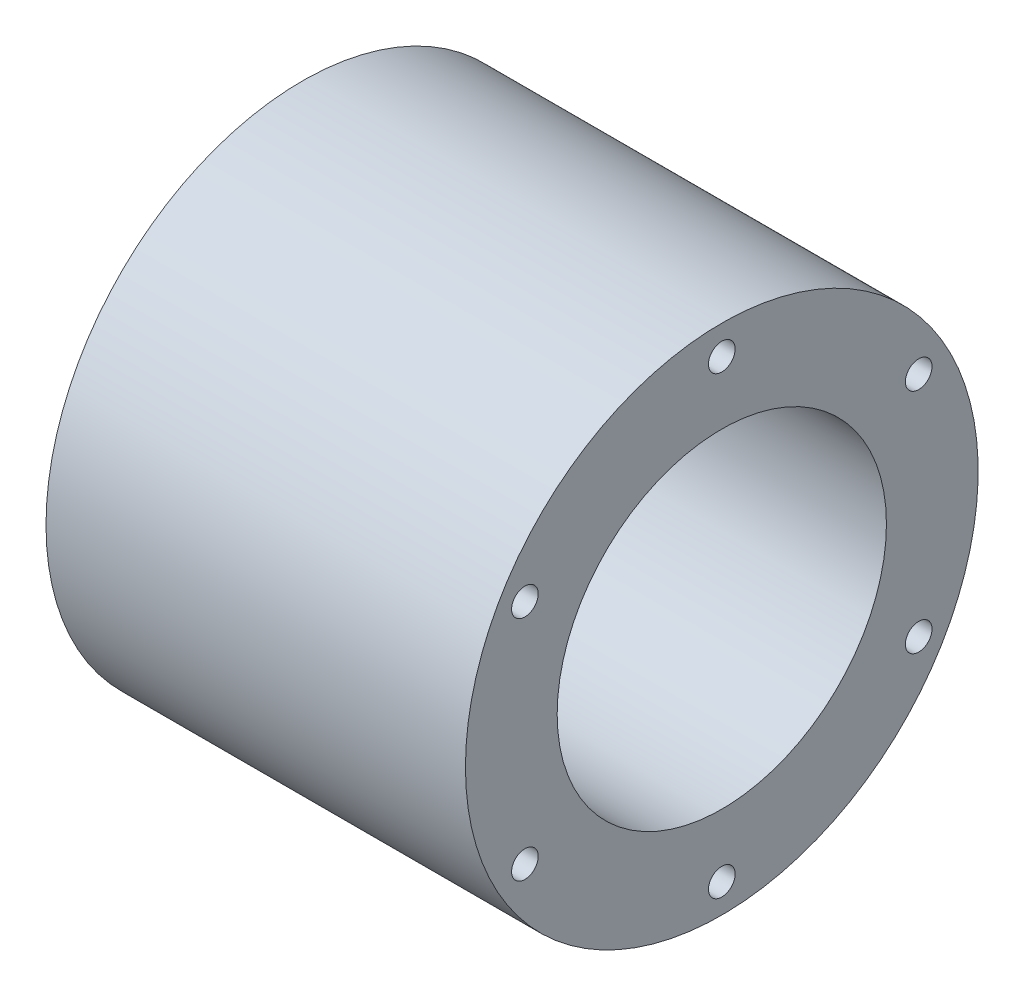
ISO-10303-21;
HEADER;
FILE_DESCRIPTION(('STEP AP214'),'2;1');
FILE_NAME('part.step','',(''),(''),'','','');
FILE_SCHEMA(('AUTOMOTIVE_DESIGN { 1 0 10303 214 1 1 1 1 }'));
ENDSEC;
DATA;
#1=APPLICATION_CONTEXT('core data for automotive mechanical design processes');
#2=APPLICATION_PROTOCOL_DEFINITION('international standard','automotive_design',2000,#1);
#3=PRODUCT_CONTEXT('',#1,'mechanical');
#4=PRODUCT('Part','Part','',(#3));
#5=PRODUCT_RELATED_PRODUCT_CATEGORY('part','',(#4));
#6=PRODUCT_DEFINITION_FORMATION('','',#4);
#7=PRODUCT_DEFINITION_CONTEXT('part definition',#1,'design');
#8=PRODUCT_DEFINITION('design','',#6,#7);
#9=PRODUCT_DEFINITION_SHAPE('','',#8);
#10=(LENGTH_UNIT() NAMED_UNIT(*) SI_UNIT(.MILLI.,.METRE.));
#11=(NAMED_UNIT(*) PLANE_ANGLE_UNIT() SI_UNIT($,.RADIAN.));
#12=(NAMED_UNIT(*) SI_UNIT($,.STERADIAN.) SOLID_ANGLE_UNIT());
#13=UNCERTAINTY_MEASURE_WITH_UNIT(LENGTH_MEASURE(1.E-05),#10,'distance_accuracy_value','');
#14=(GEOMETRIC_REPRESENTATION_CONTEXT(3) GLOBAL_UNCERTAINTY_ASSIGNED_CONTEXT((#13)) GLOBAL_UNIT_ASSIGNED_CONTEXT((#10,
#11,#12)) REPRESENTATION_CONTEXT('',''));
#15=CARTESIAN_POINT('',(0.,0.,0.));
#16=DIRECTION('',(0.,0.,1.));
#17=DIRECTION('',(1.,0.,0.));
#18=AXIS2_PLACEMENT_3D('',#15,#16,#17);
#19=CARTESIAN_POINT('',(-24.25,0.,0.));
#20=DIRECTION('',(1.,0.,0.));
#21=DIRECTION('',(0.,0.,-1.));
#22=AXIS2_PLACEMENT_3D('',#19,#20,#21);
#23=PLANE('',#22);
#24=CARTESIAN_POINT('',(-24.25,0.,0.));
#25=DIRECTION('',(1.,0.,0.));
#26=DIRECTION('',(0.,0.,-1.));
#27=AXIS2_PLACEMENT_3D('',#24,#25,#26);
#28=CIRCLE('',#27,21.);
#29=CARTESIAN_POINT('',(-24.25,-21.,0.));
#30=VERTEX_POINT('',#29);
#31=CARTESIAN_POINT('',(-24.25,-16.9951967415429,-12.3354484197474));
#32=VERTEX_POINT('',#31);
#33=EDGE_CURVE('E354',#30,#32,#28,.T.);
#34=ORIENTED_EDGE('',*,*,#33,.T.);
#35=CARTESIAN_POINT('',(-24.25,-15.5,-15.5));
#36=DIRECTION('',(-1.,0.,0.));
#37=DIRECTION('',(0.,0.,1.));
#38=AXIS2_PLACEMENT_3D('',#35,#36,#37);
#39=CIRCLE('',#38,3.5);
#40=CARTESIAN_POINT('',(-24.25,-12.3354484197474,-16.9951967415429));
#41=VERTEX_POINT('',#40);
#42=EDGE_CURVE('E224',#41,#32,#39,.T.);
#43=ORIENTED_EDGE('',*,*,#42,.F.);
#44=CARTESIAN_POINT('',(-24.25,0.,-21.));
#45=VERTEX_POINT('',#44);
#46=EDGE_CURVE('E296',#41,#45,#28,.T.);
#47=ORIENTED_EDGE('',*,*,#46,.T.);
#48=DIRECTION('',(0.,-1.,0.));
#49=VECTOR('',#48,1.);
#50=CARTESIAN_POINT('',(-24.25,-18.,-21.));
#51=LINE('',#50,#49);
#52=CARTESIAN_POINT('',(-24.25,-18.,-21.));
#53=VERTEX_POINT('',#52);
#54=EDGE_CURVE('E276',#45,#53,#51,.T.);
#55=ORIENTED_EDGE('',*,*,#54,.T.);
#56=CARTESIAN_POINT('',(-24.25,-18.,-18.));
#57=DIRECTION('',(-1.,0.,0.));
#58=DIRECTION('',(0.,0.,-1.));
#59=AXIS2_PLACEMENT_3D('',#56,#57,#58);
#60=CIRCLE('',#59,3.);
#61=CARTESIAN_POINT('',(-24.25,-21.,-18.));
#62=VERTEX_POINT('',#61);
#63=EDGE_CURVE('E230',#53,#62,#60,.T.);
#64=ORIENTED_EDGE('',*,*,#63,.T.);
#65=DIRECTION('',(0.,0.,1.));
#66=VECTOR('',#65,1.);
#67=CARTESIAN_POINT('',(-24.25,-21.,-18.));
#68=LINE('',#67,#66);
#69=EDGE_CURVE('E253',#62,#30,#68,.T.);
#70=ORIENTED_EDGE('',*,*,#69,.T.);
#71=EDGE_LOOP('',(#34,#43,#47,#55,#64,#70));
#72=FACE_BOUND('',#71,.T.);
#73=ADVANCED_FACE('F32',(#72),#23,.F.);
#74=CARTESIAN_POINT('',(-24.25,0.,21.));
#75=VERTEX_POINT('',#74);
#76=CARTESIAN_POINT('',(-24.25,-12.3354484197474,16.9951967415429));
#77=VERTEX_POINT('',#76);
#78=EDGE_CURVE('E348',#75,#77,#28,.T.);
#79=ORIENTED_EDGE('',*,*,#78,.T.);
#80=CARTESIAN_POINT('',(-24.25,-15.5,15.5));
#81=DIRECTION('',(-1.,0.,0.));
#82=DIRECTION('',(0.,0.,1.));
#83=AXIS2_PLACEMENT_3D('',#80,#81,#82);
#84=CIRCLE('',#83,3.5);
#85=CARTESIAN_POINT('',(-24.25,-16.9951967415429,12.3354484197474));
#86=VERTEX_POINT('',#85);
#87=EDGE_CURVE('E217',#86,#77,#84,.T.);
#88=ORIENTED_EDGE('',*,*,#87,.F.);
#89=EDGE_CURVE('E345',#86,#30,#28,.T.);
#90=ORIENTED_EDGE('',*,*,#89,.T.);
#91=CARTESIAN_POINT('',(-24.25,-21.,18.));
#92=VERTEX_POINT('',#91);
#93=EDGE_CURVE('E257',#30,#92,#68,.T.);
#94=ORIENTED_EDGE('',*,*,#93,.T.);
#95=CARTESIAN_POINT('',(-24.25,-18.,18.));
#96=DIRECTION('',(-1.,0.,0.));
#97=DIRECTION('',(0.,0.,1.));
#98=AXIS2_PLACEMENT_3D('',#95,#96,#97);
#99=CIRCLE('',#98,3.);
#100=CARTESIAN_POINT('',(-24.25,-18.,21.));
#101=VERTEX_POINT('',#100);
#102=EDGE_CURVE('E256',#92,#101,#99,.T.);
#103=ORIENTED_EDGE('',*,*,#102,.T.);
#104=DIRECTION('',(0.,1.,0.));
#105=VECTOR('',#104,1.);
#106=CARTESIAN_POINT('',(-24.25,-18.,21.));
#107=LINE('',#106,#105);
#108=EDGE_CURVE('E260',#101,#75,#107,.T.);
#109=ORIENTED_EDGE('',*,*,#108,.T.);
#110=EDGE_LOOP('',(#79,#88,#90,#94,#103,#109));
#111=FACE_BOUND('',#110,.T.);
#112=ADVANCED_FACE('F343',(#111),#23,.F.);
#113=CARTESIAN_POINT('',(-24.25,21.,0.));
#114=VERTEX_POINT('',#113);
#115=CARTESIAN_POINT('',(-24.25,16.9951967415429,12.3354484197474));
#116=VERTEX_POINT('',#115);
#117=EDGE_CURVE('E306',#114,#116,#28,.T.);
#118=ORIENTED_EDGE('',*,*,#117,.T.);
#119=CARTESIAN_POINT('',(-24.25,15.5,15.5));
#120=DIRECTION('',(-1.,0.,0.));
#121=DIRECTION('',(0.,0.,1.));
#122=AXIS2_PLACEMENT_3D('',#119,#120,#121);
#123=CIRCLE('',#122,3.5);
#124=CARTESIAN_POINT('',(-24.25,12.3354484197474,16.9951967415429));
#125=VERTEX_POINT('',#124);
#126=EDGE_CURVE('E220',#125,#116,#123,.T.);
#127=ORIENTED_EDGE('',*,*,#126,.F.);
#128=EDGE_CURVE('E305',#125,#75,#28,.T.);
#129=ORIENTED_EDGE('',*,*,#128,.T.);
#130=CARTESIAN_POINT('',(-24.25,18.,21.));
#131=VERTEX_POINT('',#130);
#132=EDGE_CURVE('E264',#75,#131,#107,.T.);
#133=ORIENTED_EDGE('',*,*,#132,.T.);
#134=CARTESIAN_POINT('',(-24.25,18.,18.));
#135=DIRECTION('',(-1.,0.,0.));
#136=DIRECTION('',(0.,0.,-1.));
#137=AXIS2_PLACEMENT_3D('',#134,#135,#136);
#138=CIRCLE('',#137,3.);
#139=CARTESIAN_POINT('',(-24.25,21.,18.));
#140=VERTEX_POINT('',#139);
#141=EDGE_CURVE('E263',#131,#140,#138,.T.);
#142=ORIENTED_EDGE('',*,*,#141,.T.);
#143=DIRECTION('',(0.,0.,-1.));
#144=VECTOR('',#143,1.);
#145=CARTESIAN_POINT('',(-24.25,21.,-18.));
#146=LINE('',#145,#144);
#147=EDGE_CURVE('E267',#140,#114,#146,.T.);
#148=ORIENTED_EDGE('',*,*,#147,.T.);
#149=EDGE_LOOP('',(#118,#127,#129,#133,#142,#148));
#150=FACE_BOUND('',#149,.T.);
#151=ADVANCED_FACE('F375',(#150),#23,.F.);
#152=CARTESIAN_POINT('',(24.25,0.,0.));
#153=DIRECTION('',(1.,0.,0.));
#154=DIRECTION('',(0.,0.,-1.));
#155=AXIS2_PLACEMENT_3D('',#152,#153,#154);
#156=PLANE('',#155);
#157=CARTESIAN_POINT('',(24.25,29.,0.));
#158=DIRECTION('',(1.,0.,0.));
#159=DIRECTION('',(0.,0.,-1.));
#160=AXIS2_PLACEMENT_3D('',#157,#158,#159);
#161=CIRCLE('',#160,1.69999999999999);
#162=CARTESIAN_POINT('',(24.25,29.,-1.69999999999999));
#163=VERTEX_POINT('',#162);
#164=EDGE_CURVE('E183',#163,#163,#161,.T.);
#165=ORIENTED_EDGE('',*,*,#164,.F.);
#166=EDGE_LOOP('',(#165));
#167=FACE_BOUND('',#166,.T.);
#168=CARTESIAN_POINT('',(24.25,14.5,-25.1147367097487));
#169=DIRECTION('',(1.,0.,0.));
#170=DIRECTION('',(0.,0.,-1.));
#171=AXIS2_PLACEMENT_3D('',#168,#169,#170);
#172=CIRCLE('',#171,1.69999999999999);
#173=CARTESIAN_POINT('',(24.25,14.5,-26.8147367097487));
#174=VERTEX_POINT('',#173);
#175=EDGE_CURVE('E182',#174,#174,#172,.T.);
#176=ORIENTED_EDGE('',*,*,#175,.F.);
#177=EDGE_LOOP('',(#176));
#178=FACE_BOUND('',#177,.T.);
#179=CARTESIAN_POINT('',(24.25,-14.5,-25.1147367097487));
#180=DIRECTION('',(1.,0.,0.));
#181=DIRECTION('',(0.,0.,-1.));
#182=AXIS2_PLACEMENT_3D('',#179,#180,#181);
#183=CIRCLE('',#182,1.69999999999999);
#184=CARTESIAN_POINT('',(24.25,-14.5,-26.8147367097487));
#185=VERTEX_POINT('',#184);
#186=EDGE_CURVE('E193',#185,#185,#183,.T.);
#187=ORIENTED_EDGE('',*,*,#186,.F.);
#188=EDGE_LOOP('',(#187));
#189=FACE_BOUND('',#188,.T.);
#190=CARTESIAN_POINT('',(24.25,-29.,0.));
#191=DIRECTION('',(1.,0.,0.));
#192=DIRECTION('',(0.,0.,-1.));
#193=AXIS2_PLACEMENT_3D('',#190,#191,#192);
#194=CIRCLE('',#193,1.69999999999999);
#195=CARTESIAN_POINT('',(24.25,-29.,-1.69999999999999));
#196=VERTEX_POINT('',#195);
#197=EDGE_CURVE('E199',#196,#196,#194,.T.);
#198=ORIENTED_EDGE('',*,*,#197,.F.);
#199=EDGE_LOOP('',(#198));
#200=FACE_BOUND('',#199,.T.);
#201=CARTESIAN_POINT('',(24.25,-14.5,25.1147367097487));
#202=DIRECTION('',(1.,0.,0.));
#203=DIRECTION('',(0.,0.,-1.));
#204=AXIS2_PLACEMENT_3D('',#201,#202,#203);
#205=CIRCLE('',#204,1.69999999999999);
#206=CARTESIAN_POINT('',(24.25,-14.5,23.4147367097487));
#207=VERTEX_POINT('',#206);
#208=EDGE_CURVE('E205',#207,#207,#205,.T.);
#209=ORIENTED_EDGE('',*,*,#208,.F.);
#210=EDGE_LOOP('',(#209));
#211=FACE_BOUND('',#210,.T.);
#212=CARTESIAN_POINT('',(24.25,14.5,25.1147367097487));
#213=DIRECTION('',(1.,0.,0.));
#214=DIRECTION('',(0.,0.,-1.));
#215=AXIS2_PLACEMENT_3D('',#212,#213,#214);
#216=CIRCLE('',#215,1.69999999999999);
#217=CARTESIAN_POINT('',(24.25,14.5,23.4147367097487));
#218=VERTEX_POINT('',#217);
#219=EDGE_CURVE('E211',#218,#218,#216,.T.);
#220=ORIENTED_EDGE('',*,*,#219,.F.);
#221=EDGE_LOOP('',(#220));
#222=FACE_BOUND('',#221,.T.);
#223=CARTESIAN_POINT('',(24.25,0.,0.));
#224=DIRECTION('',(1.,0.,0.));
#225=DIRECTION('',(0.,0.,-1.));
#226=AXIS2_PLACEMENT_3D('',#223,#224,#225);
#227=CIRCLE('',#226,32.7);
#228=CARTESIAN_POINT('',(24.25,0.,32.7));
#229=VERTEX_POINT('',#228);
#230=EDGE_CURVE('E300',#229,#229,#227,.T.);
#231=ORIENTED_EDGE('',*,*,#230,.T.);
#232=EDGE_LOOP('',(#231));
#233=FACE_BOUND('',#232,.T.);
#234=CARTESIAN_POINT('',(24.25,0.,0.));
#235=DIRECTION('',(1.,0.,0.));
#236=DIRECTION('',(0.,0.,-1.));
#237=AXIS2_PLACEMENT_3D('',#234,#235,#236);
#238=CIRCLE('',#237,21.);
#239=CARTESIAN_POINT('',(24.25,0.,-21.));
#240=VERTEX_POINT('',#239);
#241=EDGE_CURVE('E297',#240,#240,#238,.T.);
#242=ORIENTED_EDGE('',*,*,#241,.F.);
#243=EDGE_LOOP('',(#242));
#244=FACE_BOUND('',#243,.T.);
#245=ADVANCED_FACE('F403',(#167,#178,#189,#200,#211,#222,#233,#244),#156,.T.);
#246=CARTESIAN_POINT('',(-24.25,12.3354484197474,-16.9951967415429));
#247=VERTEX_POINT('',#246);
#248=EDGE_CURVE('E301',#45,#247,#28,.T.);
#249=ORIENTED_EDGE('',*,*,#248,.T.);
#250=CARTESIAN_POINT('',(-24.25,15.5,-15.5));
#251=DIRECTION('',(-1.,0.,0.));
#252=DIRECTION('',(0.,0.,1.));
#253=AXIS2_PLACEMENT_3D('',#250,#251,#252);
#254=CIRCLE('',#253,3.5);
#255=CARTESIAN_POINT('',(-24.25,16.9951967415429,-12.3354484197474));
#256=VERTEX_POINT('',#255);
#257=EDGE_CURVE('E221',#256,#247,#254,.T.);
#258=ORIENTED_EDGE('',*,*,#257,.F.);
#259=EDGE_CURVE('E304',#256,#114,#28,.T.);
#260=ORIENTED_EDGE('',*,*,#259,.T.);
#261=CARTESIAN_POINT('',(-24.25,21.,-18.));
#262=VERTEX_POINT('',#261);
#263=EDGE_CURVE('E271',#114,#262,#146,.T.);
#264=ORIENTED_EDGE('',*,*,#263,.T.);
#265=CARTESIAN_POINT('',(-24.25,18.,-18.));
#266=DIRECTION('',(-1.,0.,0.));
#267=DIRECTION('',(0.,0.,-1.));
#268=AXIS2_PLACEMENT_3D('',#265,#266,#267);
#269=CIRCLE('',#268,3.);
#270=CARTESIAN_POINT('',(-24.25,18.,-21.));
#271=VERTEX_POINT('',#270);
#272=EDGE_CURVE('E270',#262,#271,#269,.T.);
#273=ORIENTED_EDGE('',*,*,#272,.T.);
#274=EDGE_CURVE('E235',#271,#45,#51,.T.);
#275=ORIENTED_EDGE('',*,*,#274,.T.);
#276=EDGE_LOOP('',(#249,#258,#260,#264,#273,#275));
#277=FACE_BOUND('',#276,.T.);
#278=ADVANCED_FACE('F367',(#277),#23,.F.);
#279=CARTESIAN_POINT('',(24.25,0.,0.));
#280=DIRECTION('',(-1.,0.,0.));
#281=DIRECTION('',(0.,0.,1.));
#282=AXIS2_PLACEMENT_3D('',#279,#280,#281);
#283=CYLINDRICAL_SURFACE('',#282,32.7);
#284=CARTESIAN_POINT('',(-29.25,0.,0.));
#285=DIRECTION('',(-1.,0.,0.));
#286=DIRECTION('',(0.,0.,1.));
#287=AXIS2_PLACEMENT_3D('',#284,#285,#286);
#288=CIRCLE('',#287,32.7);
#289=CARTESIAN_POINT('',(-29.25,0.,32.7));
#290=VERTEX_POINT('',#289);
#291=EDGE_CURVE('E293',#290,#290,#288,.T.);
#292=CARTESIAN_POINT('',(24.25,0.,32.7));
#293=CARTESIAN_POINT('',(23.6927083333333,0.,32.7));
#294=CARTESIAN_POINT('',(23.1354166666667,0.,32.7));
#295=CARTESIAN_POINT('',(22.0208333333333,0.,32.7));
#296=CARTESIAN_POINT('',(21.4635416666667,0.,32.7));
#297=CARTESIAN_POINT('',(20.3489583333333,0.,32.7));
#298=CARTESIAN_POINT('',(19.7916666666667,0.,32.7));
#299=CARTESIAN_POINT('',(18.6770833333333,0.,32.7));
#300=CARTESIAN_POINT('',(18.1197916666667,0.,32.7));
#301=CARTESIAN_POINT('',(17.0052083333333,0.,32.7));
#302=CARTESIAN_POINT('',(16.4479166666667,0.,32.7));
#303=CARTESIAN_POINT('',(15.3333333333333,0.,32.7));
#304=CARTESIAN_POINT('',(14.7760416666667,0.,32.7));
#305=CARTESIAN_POINT('',(13.6614583333333,0.,32.7));
#306=CARTESIAN_POINT('',(13.1041666666667,0.,32.7));
#307=CARTESIAN_POINT('',(11.9895833333333,0.,32.7));
#308=CARTESIAN_POINT('',(11.4322916666667,0.,32.7));
#309=CARTESIAN_POINT('',(10.3177083333333,0.,32.7));
#310=CARTESIAN_POINT('',(9.76041666666667,0.,32.7));
#311=CARTESIAN_POINT('',(8.64583333333333,0.,32.7));
#312=CARTESIAN_POINT('',(8.08854166666667,0.,32.7));
#313=CARTESIAN_POINT('',(6.97395833333333,0.,32.7));
#314=CARTESIAN_POINT('',(6.41666666666667,0.,32.7));
#315=CARTESIAN_POINT('',(5.30208333333333,0.,32.7));
#316=CARTESIAN_POINT('',(4.74479166666666,0.,32.7));
#317=CARTESIAN_POINT('',(3.63020833333333,0.,32.7));
#318=CARTESIAN_POINT('',(3.07291666666666,0.,32.7));
#319=CARTESIAN_POINT('',(1.95833333333333,0.,32.7));
#320=CARTESIAN_POINT('',(1.40104166666666,0.,32.7));
#321=CARTESIAN_POINT('',(0.286458333333331,0.,32.7));
#322=CARTESIAN_POINT('',(-0.270833333333336,0.,32.7));
#323=CARTESIAN_POINT('',(-1.38541666666667,0.,32.7));
#324=CARTESIAN_POINT('',(-1.94270833333334,0.,32.7));
#325=CARTESIAN_POINT('',(-3.05729166666667,0.,32.7));
#326=CARTESIAN_POINT('',(-3.61458333333334,0.,32.7));
#327=CARTESIAN_POINT('',(-4.72916666666667,0.,32.7));
#328=CARTESIAN_POINT('',(-5.28645833333333,0.,32.7));
#329=CARTESIAN_POINT('',(-6.40104166666667,0.,32.7));
#330=CARTESIAN_POINT('',(-6.95833333333333,0.,32.7));
#331=CARTESIAN_POINT('',(-8.07291666666666,0.,32.7));
#332=CARTESIAN_POINT('',(-8.63020833333333,0.,32.7));
#333=CARTESIAN_POINT('',(-9.74479166666666,0.,32.7));
#334=CARTESIAN_POINT('',(-10.3020833333333,0.,32.7));
#335=CARTESIAN_POINT('',(-11.4166666666667,0.,32.7));
#336=CARTESIAN_POINT('',(-11.9739583333333,0.,32.7));
#337=CARTESIAN_POINT('',(-13.0885416666667,0.,32.7));
#338=CARTESIAN_POINT('',(-13.6458333333333,0.,32.7));
#339=CARTESIAN_POINT('',(-14.7604166666667,0.,32.7));
#340=CARTESIAN_POINT('',(-15.3177083333333,0.,32.7));
#341=CARTESIAN_POINT('',(-16.4322916666667,0.,32.7));
#342=CARTESIAN_POINT('',(-16.9895833333333,0.,32.7));
#343=CARTESIAN_POINT('',(-18.1041666666667,0.,32.7));
#344=CARTESIAN_POINT('',(-18.6614583333333,0.,32.7));
#345=CARTESIAN_POINT('',(-19.7760416666667,0.,32.7));
#346=CARTESIAN_POINT('',(-20.3333333333333,0.,32.7));
#347=CARTESIAN_POINT('',(-21.4479166666667,0.,32.7));
#348=CARTESIAN_POINT('',(-22.0052083333333,0.,32.7));
#349=CARTESIAN_POINT('',(-23.1197916666667,0.,32.7));
#350=CARTESIAN_POINT('',(-23.6770833333333,0.,32.7));
#351=CARTESIAN_POINT('',(-24.7916666666667,0.,32.7));
#352=CARTESIAN_POINT('',(-25.3489583333333,0.,32.7));
#353=CARTESIAN_POINT('',(-26.4635416666667,0.,32.7));
#354=CARTESIAN_POINT('',(-27.0208333333333,0.,32.7));
#355=CARTESIAN_POINT('',(-28.1354166666667,0.,32.7));
#356=CARTESIAN_POINT('',(-28.6927083333333,0.,32.7));
#357=CARTESIAN_POINT('',(-29.25,0.,32.7));
#358=B_SPLINE_CURVE_WITH_KNOTS('',3,(#292,#293,#294,#295,#296,#297,#298,#299,#300,#301,#302,
#303,#304,#305,#306,#307,#308,#309,#310,#311,#312,#313,#314,#315,#316,#317,#318,#319,#320,#321,
#322,#323,#324,#325,#326,#327,#328,#329,#330,#331,#332,#333,#334,#335,#336,#337,#338,#339,#340,
#341,#342,#343,#344,#345,#346,#347,#348,#349,#350,#351,#352,#353,#354,#355,#356,#357),
.UNSPECIFIED.,.F.,.F.,(4,2,2,2,2,2,2,2,2,2,2,2,2,2,2,2,2,2,2,2,2,2,2,2,2,2,2,2,2,2,2,2,4),(0.,
1.671875,3.34375,5.015625,6.6875,8.359375,10.03125,11.703125,13.375,15.046875,16.71875,
18.390625,20.0625,21.734375,23.40625,25.078125,26.75,28.421875,30.09375,31.765625,33.4375,
35.109375,36.78125,38.453125,40.125,41.796875,43.46875,45.140625,46.8125,48.484375,50.15625,
51.828125,53.5),.UNSPECIFIED.);
#359=EDGE_CURVE('BSEAM34',#229,#290,#358,.T.);
#360=ORIENTED_EDGE('',*,*,#230,.F.);
#361=ORIENTED_EDGE('',*,*,#291,.F.);
#362=ORIENTED_EDGE('',*,*,#359,.T.);
#363=ORIENTED_EDGE('',*,*,#359,.F.);
#364=EDGE_LOOP('',(#360,#362,#361,#363));
#365=FACE_BOUND('',#364,.T.);
#366=ADVANCED_FACE('F34',(#365),#283,.T.);
#367=CARTESIAN_POINT('',(24.25,0.,0.));
#368=DIRECTION('',(-1.,0.,0.));
#369=DIRECTION('',(0.,0.,1.));
#370=AXIS2_PLACEMENT_3D('',#367,#368,#369);
#371=CYLINDRICAL_SURFACE('',#370,21.);
#372=DIRECTION('',(-1.,0.,0.));
#373=VECTOR('',#372,1.);
#374=CARTESIAN_POINT('',(-21.25,-12.3354484197474,16.9951967415429));
#375=LINE('',#374,#373);
#376=CARTESIAN_POINT('',(-18.25,-12.3354484197474,16.9951967415429));
#377=VERTEX_POINT('',#376);
#378=EDGE_CURVE('E11',#77,#377,#375,.F.);
#379=ORIENTED_EDGE('',*,*,#378,.F.);
#380=ORIENTED_EDGE('',*,*,#78,.F.);
#381=ORIENTED_EDGE('',*,*,#128,.F.);
#382=DIRECTION('',(-1.,0.,0.));
#383=VECTOR('',#382,1.);
#384=CARTESIAN_POINT('',(-21.25,12.3354484197474,16.9951967415429));
#385=LINE('',#384,#383);
#386=CARTESIAN_POINT('',(-18.25,12.3354484197474,16.9951967415429));
#387=VERTEX_POINT('',#386);
#388=EDGE_CURVE('E312',#387,#125,#385,.T.);
#389=ORIENTED_EDGE('',*,*,#388,.F.);
#390=CARTESIAN_POINT('',(-18.25,0.,0.));
#391=DIRECTION('',(-1.,0.,0.));
#392=DIRECTION('',(0.,0.,1.));
#393=AXIS2_PLACEMENT_3D('',#390,#391,#392);
#394=CIRCLE('',#393,21.);
#395=CARTESIAN_POINT('',(-18.25,16.9951967415429,12.3354484197474));
#396=VERTEX_POINT('',#395);
#397=EDGE_CURVE('E309',#387,#396,#394,.T.);
#398=ORIENTED_EDGE('',*,*,#397,.T.);
#399=DIRECTION('',(-1.,0.,0.));
#400=VECTOR('',#399,1.);
#401=CARTESIAN_POINT('',(-21.25,16.9951967415429,12.3354484197474));
#402=LINE('',#401,#400);
#403=EDGE_CURVE('E314',#116,#396,#402,.F.);
#404=ORIENTED_EDGE('',*,*,#403,.F.);
#405=ORIENTED_EDGE('',*,*,#117,.F.);
#406=ORIENTED_EDGE('',*,*,#259,.F.);
#407=DIRECTION('',(-1.,0.,0.));
#408=VECTOR('',#407,1.);
#409=CARTESIAN_POINT('',(-21.25,16.9951967415429,-12.3354484197474));
#410=LINE('',#409,#408);
#411=CARTESIAN_POINT('',(-18.25,16.9951967415429,-12.3354484197474));
#412=VERTEX_POINT('',#411);
#413=EDGE_CURVE('E320',#412,#256,#410,.T.);
#414=ORIENTED_EDGE('',*,*,#413,.F.);
#415=CARTESIAN_POINT('',(-18.25,0.,0.));
#416=DIRECTION('',(-1.,0.,0.));
#417=DIRECTION('',(0.,0.,1.));
#418=AXIS2_PLACEMENT_3D('',#415,#416,#417);
#419=CIRCLE('',#418,21.);
#420=CARTESIAN_POINT('',(-18.25,12.3354484197474,-16.9951967415429));
#421=VERTEX_POINT('',#420);
#422=EDGE_CURVE('E317',#412,#421,#419,.T.);
#423=ORIENTED_EDGE('',*,*,#422,.T.);
#424=DIRECTION('',(-1.,0.,0.));
#425=VECTOR('',#424,1.);
#426=CARTESIAN_POINT('',(-21.25,12.3354484197474,-16.9951967415429));
#427=LINE('',#426,#425);
#428=EDGE_CURVE('E322',#247,#421,#427,.F.);
#429=ORIENTED_EDGE('',*,*,#428,.F.);
#430=ORIENTED_EDGE('',*,*,#248,.F.);
#431=ORIENTED_EDGE('',*,*,#46,.F.);
#432=DIRECTION('',(-1.,0.,0.));
#433=VECTOR('',#432,1.);
#434=CARTESIAN_POINT('',(-21.25,-12.3354484197474,-16.9951967415429));
#435=LINE('',#434,#433);
#436=CARTESIAN_POINT('',(-18.25,-12.3354484197474,-16.9951967415429));
#437=VERTEX_POINT('',#436);
#438=EDGE_CURVE('E328',#437,#41,#435,.T.);
#439=ORIENTED_EDGE('',*,*,#438,.F.);
#440=CARTESIAN_POINT('',(-18.25,0.,0.));
#441=DIRECTION('',(-1.,0.,0.));
#442=DIRECTION('',(0.,0.,1.));
#443=AXIS2_PLACEMENT_3D('',#440,#441,#442);
#444=CIRCLE('',#443,21.);
#445=CARTESIAN_POINT('',(-18.25,-16.9951967415429,-12.3354484197474));
#446=VERTEX_POINT('',#445);
#447=EDGE_CURVE('E325',#437,#446,#444,.T.);
#448=ORIENTED_EDGE('',*,*,#447,.T.);
#449=DIRECTION('',(-1.,0.,0.));
#450=VECTOR('',#449,1.);
#451=CARTESIAN_POINT('',(-21.25,-16.9951967415429,-12.3354484197474));
#452=LINE('',#451,#450);
#453=EDGE_CURVE('E330',#32,#446,#452,.F.);
#454=ORIENTED_EDGE('',*,*,#453,.F.);
#455=ORIENTED_EDGE('',*,*,#33,.F.);
#456=ORIENTED_EDGE('',*,*,#89,.F.);
#457=DIRECTION('',(-1.,0.,0.));
#458=VECTOR('',#457,1.);
#459=CARTESIAN_POINT('',(-21.25,-16.9951967415429,12.3354484197474));
#460=LINE('',#459,#458);
#461=CARTESIAN_POINT('',(-18.25,-16.9951967415429,12.3354484197474));
#462=VERTEX_POINT('',#461);
#463=EDGE_CURVE('E40',#462,#86,#460,.T.);
#464=ORIENTED_EDGE('',*,*,#463,.F.);
#465=CARTESIAN_POINT('',(-18.25,0.,0.));
#466=DIRECTION('',(-1.,0.,0.));
#467=DIRECTION('',(0.,0.,1.));
#468=AXIS2_PLACEMENT_3D('',#465,#466,#467);
#469=CIRCLE('',#468,21.);
#470=EDGE_CURVE('E332',#462,#377,#469,.T.);
#471=ORIENTED_EDGE('',*,*,#470,.T.);
#472=EDGE_LOOP('',(#379,#380,#381,#389,#398,#404,#405,#406,#414,#423,#429,#430,#431,#439,#448,
#454,#455,#456,#464,#471));
#473=FACE_BOUND('',#472,.T.);
#474=ORIENTED_EDGE('',*,*,#241,.T.);
#475=EDGE_LOOP('',(#474));
#476=FACE_BOUND('',#475,.T.);
#477=ADVANCED_FACE('F350',(#473,#476),#371,.F.);
#478=CARTESIAN_POINT('',(-29.25,0.,0.));
#479=DIRECTION('',(-1.,0.,0.));
#480=DIRECTION('',(0.,0.,1.));
#481=AXIS2_PLACEMENT_3D('',#478,#479,#480);
#482=PLANE('',#481);
#483=ORIENTED_EDGE('',*,*,#291,.T.);
#484=EDGE_LOOP('',(#483));
#485=FACE_BOUND('',#484,.T.);
#486=DIRECTION('',(0.,0.,1.));
#487=VECTOR('',#486,1.);
#488=CARTESIAN_POINT('',(-29.25,-21.,-18.));
#489=LINE('',#488,#487);
#490=CARTESIAN_POINT('',(-29.25,-21.,-18.));
#491=VERTEX_POINT('',#490);
#492=CARTESIAN_POINT('',(-29.25,-21.,18.));
#493=VERTEX_POINT('',#492);
#494=EDGE_CURVE('E234',#491,#493,#489,.T.);
#495=ORIENTED_EDGE('',*,*,#494,.F.);
#496=CARTESIAN_POINT('',(-29.25,-18.,-18.));
#497=DIRECTION('',(-1.,0.,0.));
#498=DIRECTION('',(0.,0.,-1.));
#499=AXIS2_PLACEMENT_3D('',#496,#497,#498);
#500=CIRCLE('',#499,3.);
#501=CARTESIAN_POINT('',(-29.25,-18.,-21.));
#502=VERTEX_POINT('',#501);
#503=EDGE_CURVE('E232',#502,#491,#500,.T.);
#504=ORIENTED_EDGE('',*,*,#503,.F.);
#505=DIRECTION('',(0.,-1.,0.));
#506=VECTOR('',#505,1.);
#507=CARTESIAN_POINT('',(-29.25,-18.,-21.));
#508=LINE('',#507,#506);
#509=CARTESIAN_POINT('',(-29.25,18.,-21.));
#510=VERTEX_POINT('',#509);
#511=EDGE_CURVE('E248',#510,#502,#508,.T.);
#512=ORIENTED_EDGE('',*,*,#511,.F.);
#513=CARTESIAN_POINT('',(-29.25,18.,-18.));
#514=DIRECTION('',(-1.,0.,0.));
#515=DIRECTION('',(0.,0.,-1.));
#516=AXIS2_PLACEMENT_3D('',#513,#514,#515);
#517=CIRCLE('',#516,3.);
#518=CARTESIAN_POINT('',(-29.25,21.,-18.));
#519=VERTEX_POINT('',#518);
#520=EDGE_CURVE('E245',#519,#510,#517,.T.);
#521=ORIENTED_EDGE('',*,*,#520,.F.);
#522=DIRECTION('',(0.,0.,-1.));
#523=VECTOR('',#522,1.);
#524=CARTESIAN_POINT('',(-29.25,21.,-18.));
#525=LINE('',#524,#523);
#526=CARTESIAN_POINT('',(-29.25,21.,18.));
#527=VERTEX_POINT('',#526);
#528=EDGE_CURVE('E243',#527,#519,#525,.T.);
#529=ORIENTED_EDGE('',*,*,#528,.F.);
#530=CARTESIAN_POINT('',(-29.25,18.,18.));
#531=DIRECTION('',(-1.,0.,0.));
#532=DIRECTION('',(0.,0.,-1.));
#533=AXIS2_PLACEMENT_3D('',#530,#531,#532);
#534=CIRCLE('',#533,3.);
#535=CARTESIAN_POINT('',(-29.25,18.,21.));
#536=VERTEX_POINT('',#535);
#537=EDGE_CURVE('E241',#536,#527,#534,.T.);
#538=ORIENTED_EDGE('',*,*,#537,.F.);
#539=DIRECTION('',(0.,1.,0.));
#540=VECTOR('',#539,1.);
#541=CARTESIAN_POINT('',(-29.25,-18.,21.));
#542=LINE('',#541,#540);
#543=CARTESIAN_POINT('',(-29.25,-18.,21.));
#544=VERTEX_POINT('',#543);
#545=EDGE_CURVE('E239',#544,#536,#542,.T.);
#546=ORIENTED_EDGE('',*,*,#545,.F.);
#547=CARTESIAN_POINT('',(-29.25,-18.,18.));
#548=DIRECTION('',(-1.,0.,0.));
#549=DIRECTION('',(0.,0.,1.));
#550=AXIS2_PLACEMENT_3D('',#547,#548,#549);
#551=CIRCLE('',#550,3.);
#552=EDGE_CURVE('E237',#493,#544,#551,.T.);
#553=ORIENTED_EDGE('',*,*,#552,.F.);
#554=EDGE_LOOP('',(#495,#504,#512,#521,#529,#538,#546,#553));
#555=FACE_BOUND('',#554,.T.);
#556=ADVANCED_FACE('F569',(#485,#555),#482,.T.);
#557=CARTESIAN_POINT('',(-29.25,-18.,-18.));
#558=DIRECTION('',(1.,0.,0.));
#559=DIRECTION('',(0.,0.,-1.));
#560=AXIS2_PLACEMENT_3D('',#557,#558,#559);
#561=CYLINDRICAL_SURFACE('',#560,3.);
#562=ORIENTED_EDGE('',*,*,#63,.F.);
#563=DIRECTION('',(1.,0.,0.));
#564=VECTOR('',#563,1.);
#565=CARTESIAN_POINT('',(-29.25,-18.,-21.));
#566=LINE('',#565,#564);
#567=EDGE_CURVE('E250',#502,#53,#566,.T.);
#568=ORIENTED_EDGE('',*,*,#567,.F.);
#569=ORIENTED_EDGE('',*,*,#503,.T.);
#570=DIRECTION('',(1.,0.,0.));
#571=VECTOR('',#570,1.);
#572=CARTESIAN_POINT('',(-29.25,-21.,-18.));
#573=LINE('',#572,#571);
#574=EDGE_CURVE('E290',#491,#62,#573,.T.);
#575=ORIENTED_EDGE('',*,*,#574,.T.);
#576=EDGE_LOOP('',(#562,#568,#569,#575));
#577=FACE_BOUND('',#576,.T.);
#578=ADVANCED_FACE('F564',(#577),#561,.F.);
#579=CARTESIAN_POINT('',(-29.25,-21.,-18.));
#580=DIRECTION('',(0.,1.,0.));
#581=DIRECTION('',(0.,0.,1.));
#582=AXIS2_PLACEMENT_3D('',#579,#580,#581);
#583=PLANE('',#582);
#584=ORIENTED_EDGE('',*,*,#69,.F.);
#585=ORIENTED_EDGE('',*,*,#574,.F.);
#586=ORIENTED_EDGE('',*,*,#494,.T.);
#587=DIRECTION('',(1.,0.,0.));
#588=VECTOR('',#587,1.);
#589=CARTESIAN_POINT('',(-29.25,-21.,18.));
#590=LINE('',#589,#588);
#591=EDGE_CURVE('E288',#493,#92,#590,.T.);
#592=ORIENTED_EDGE('',*,*,#591,.T.);
#593=ORIENTED_EDGE('',*,*,#93,.F.);
#594=EDGE_LOOP('',(#584,#585,#586,#592,#593));
#595=FACE_BOUND('',#594,.T.);
#596=ADVANCED_FACE('F561',(#595),#583,.T.);
#597=CARTESIAN_POINT('',(-29.25,-18.,18.));
#598=DIRECTION('',(1.,0.,0.));
#599=DIRECTION('',(0.,0.,-1.));
#600=AXIS2_PLACEMENT_3D('',#597,#598,#599);
#601=CYLINDRICAL_SURFACE('',#600,3.);
#602=ORIENTED_EDGE('',*,*,#102,.F.);
#603=ORIENTED_EDGE('',*,*,#591,.F.);
#604=ORIENTED_EDGE('',*,*,#552,.T.);
#605=DIRECTION('',(1.,0.,0.));
#606=VECTOR('',#605,1.);
#607=CARTESIAN_POINT('',(-29.25,-18.,21.));
#608=LINE('',#607,#606);
#609=EDGE_CURVE('E286',#544,#101,#608,.T.);
#610=ORIENTED_EDGE('',*,*,#609,.T.);
#611=EDGE_LOOP('',(#602,#603,#604,#610));
#612=FACE_BOUND('',#611,.T.);
#613=ADVANCED_FACE('F576',(#612),#601,.F.);
#614=CARTESIAN_POINT('',(-29.25,-18.,21.));
#615=DIRECTION('',(0.,0.,-1.));
#616=DIRECTION('',(-1.,0.,0.));
#617=AXIS2_PLACEMENT_3D('',#614,#615,#616);
#618=PLANE('',#617);
#619=ORIENTED_EDGE('',*,*,#108,.F.);
#620=ORIENTED_EDGE('',*,*,#609,.F.);
#621=ORIENTED_EDGE('',*,*,#545,.T.);
#622=DIRECTION('',(1.,0.,0.));
#623=VECTOR('',#622,1.);
#624=CARTESIAN_POINT('',(-29.25,18.,21.));
#625=LINE('',#624,#623);
#626=EDGE_CURVE('E284',#536,#131,#625,.T.);
#627=ORIENTED_EDGE('',*,*,#626,.T.);
#628=ORIENTED_EDGE('',*,*,#132,.F.);
#629=EDGE_LOOP('',(#619,#620,#621,#627,#628));
#630=FACE_BOUND('',#629,.T.);
#631=ADVANCED_FACE('F580',(#630),#618,.T.);
#632=CARTESIAN_POINT('',(-29.25,18.,18.));
#633=DIRECTION('',(1.,0.,0.));
#634=DIRECTION('',(0.,0.,-1.));
#635=AXIS2_PLACEMENT_3D('',#632,#633,#634);
#636=CYLINDRICAL_SURFACE('',#635,3.);
#637=ORIENTED_EDGE('',*,*,#141,.F.);
#638=ORIENTED_EDGE('',*,*,#626,.F.);
#639=ORIENTED_EDGE('',*,*,#537,.T.);
#640=DIRECTION('',(1.,0.,0.));
#641=VECTOR('',#640,1.);
#642=CARTESIAN_POINT('',(-29.25,21.,18.));
#643=LINE('',#642,#641);
#644=EDGE_CURVE('E282',#527,#140,#643,.T.);
#645=ORIENTED_EDGE('',*,*,#644,.T.);
#646=EDGE_LOOP('',(#637,#638,#639,#645));
#647=FACE_BOUND('',#646,.T.);
#648=ADVANCED_FACE('F584',(#647),#636,.F.);
#649=CARTESIAN_POINT('',(-29.25,21.,-18.));
#650=DIRECTION('',(0.,-1.,0.));
#651=DIRECTION('',(0.,0.,-1.));
#652=AXIS2_PLACEMENT_3D('',#649,#650,#651);
#653=PLANE('',#652);
#654=ORIENTED_EDGE('',*,*,#147,.F.);
#655=ORIENTED_EDGE('',*,*,#644,.F.);
#656=ORIENTED_EDGE('',*,*,#528,.T.);
#657=DIRECTION('',(1.,0.,0.));
#658=VECTOR('',#657,1.);
#659=CARTESIAN_POINT('',(-29.25,21.,-18.));
#660=LINE('',#659,#658);
#661=EDGE_CURVE('E280',#519,#262,#660,.T.);
#662=ORIENTED_EDGE('',*,*,#661,.T.);
#663=ORIENTED_EDGE('',*,*,#263,.F.);
#664=EDGE_LOOP('',(#654,#655,#656,#662,#663));
#665=FACE_BOUND('',#664,.T.);
#666=ADVANCED_FACE('F371',(#665),#653,.T.);
#667=CARTESIAN_POINT('',(-29.25,18.,-18.));
#668=DIRECTION('',(1.,0.,0.));
#669=DIRECTION('',(0.,0.,-1.));
#670=AXIS2_PLACEMENT_3D('',#667,#668,#669);
#671=CYLINDRICAL_SURFACE('',#670,3.);
#672=ORIENTED_EDGE('',*,*,#272,.F.);
#673=ORIENTED_EDGE('',*,*,#661,.F.);
#674=ORIENTED_EDGE('',*,*,#520,.T.);
#675=DIRECTION('',(1.,0.,0.));
#676=VECTOR('',#675,1.);
#677=CARTESIAN_POINT('',(-29.25,18.,-21.));
#678=LINE('',#677,#676);
#679=EDGE_CURVE('E278',#510,#271,#678,.T.);
#680=ORIENTED_EDGE('',*,*,#679,.T.);
#681=EDGE_LOOP('',(#672,#673,#674,#680));
#682=FACE_BOUND('',#681,.T.);
#683=ADVANCED_FACE('F587',(#682),#671,.F.);
#684=CARTESIAN_POINT('',(-29.25,-18.,-21.));
#685=DIRECTION('',(0.,0.,1.));
#686=DIRECTION('',(1.,0.,0.));
#687=AXIS2_PLACEMENT_3D('',#684,#685,#686);
#688=PLANE('',#687);
#689=ORIENTED_EDGE('',*,*,#274,.F.);
#690=ORIENTED_EDGE('',*,*,#679,.F.);
#691=ORIENTED_EDGE('',*,*,#511,.T.);
#692=ORIENTED_EDGE('',*,*,#567,.T.);
#693=ORIENTED_EDGE('',*,*,#54,.F.);
#694=EDGE_LOOP('',(#689,#690,#691,#692,#693));
#695=FACE_BOUND('',#694,.T.);
#696=ADVANCED_FACE('F592',(#695),#688,.T.);
#697=CARTESIAN_POINT('',(-18.25,15.5,15.5));
#698=DIRECTION('',(-1.,0.,0.));
#699=DIRECTION('',(0.,0.,1.));
#700=AXIS2_PLACEMENT_3D('',#697,#698,#699);
#701=CYLINDRICAL_SURFACE('',#700,3.5);
#702=ORIENTED_EDGE('',*,*,#403,.T.);
#703=CARTESIAN_POINT('',(-18.25,15.5,15.5));
#704=DIRECTION('',(-1.,0.,0.));
#705=DIRECTION('',(0.,0.,1.));
#706=AXIS2_PLACEMENT_3D('',#703,#704,#705);
#707=CIRCLE('',#706,3.5);
#708=EDGE_CURVE('E228',#387,#396,#707,.T.);
#709=ORIENTED_EDGE('',*,*,#708,.F.);
#710=ORIENTED_EDGE('',*,*,#388,.T.);
#711=ORIENTED_EDGE('',*,*,#126,.T.);
#712=EDGE_LOOP('',(#702,#709,#710,#711));
#713=FACE_BOUND('',#712,.T.);
#714=ADVANCED_FACE('F381',(#713),#701,.F.);
#715=CARTESIAN_POINT('',(-18.25,15.5,15.5));
#716=DIRECTION('',(-1.,0.,0.));
#717=DIRECTION('',(0.,0.,1.));
#718=AXIS2_PLACEMENT_3D('',#715,#716,#717);
#719=PLANE('',#718);
#720=ORIENTED_EDGE('',*,*,#708,.T.);
#721=ORIENTED_EDGE('',*,*,#397,.F.);
#722=EDGE_LOOP('',(#720,#721));
#723=FACE_BOUND('',#722,.T.);
#724=ADVANCED_FACE('F545',(#723),#719,.T.);
#725=CARTESIAN_POINT('',(-18.25,15.5,-15.5));
#726=DIRECTION('',(-1.,0.,0.));
#727=DIRECTION('',(0.,0.,1.));
#728=AXIS2_PLACEMENT_3D('',#725,#726,#727);
#729=CYLINDRICAL_SURFACE('',#728,3.5);
#730=ORIENTED_EDGE('',*,*,#428,.T.);
#731=CARTESIAN_POINT('',(-18.25,15.5,-15.5));
#732=DIRECTION('',(-1.,0.,0.));
#733=DIRECTION('',(0.,0.,1.));
#734=AXIS2_PLACEMENT_3D('',#731,#732,#733);
#735=CIRCLE('',#734,3.5);
#736=EDGE_CURVE('E218',#412,#421,#735,.T.);
#737=ORIENTED_EDGE('',*,*,#736,.F.);
#738=ORIENTED_EDGE('',*,*,#413,.T.);
#739=ORIENTED_EDGE('',*,*,#257,.T.);
#740=EDGE_LOOP('',(#730,#737,#738,#739));
#741=FACE_BOUND('',#740,.T.);
#742=ADVANCED_FACE('F541',(#741),#729,.F.);
#743=CARTESIAN_POINT('',(-18.25,15.5,-15.5));
#744=DIRECTION('',(-1.,0.,0.));
#745=DIRECTION('',(0.,0.,1.));
#746=AXIS2_PLACEMENT_3D('',#743,#744,#745);
#747=PLANE('',#746);
#748=ORIENTED_EDGE('',*,*,#736,.T.);
#749=ORIENTED_EDGE('',*,*,#422,.F.);
#750=EDGE_LOOP('',(#748,#749));
#751=FACE_BOUND('',#750,.T.);
#752=ADVANCED_FACE('F537',(#751),#747,.T.);
#753=CARTESIAN_POINT('',(-18.25,-15.5,-15.5));
#754=DIRECTION('',(-1.,0.,0.));
#755=DIRECTION('',(0.,0.,1.));
#756=AXIS2_PLACEMENT_3D('',#753,#754,#755);
#757=CYLINDRICAL_SURFACE('',#756,3.5);
#758=ORIENTED_EDGE('',*,*,#453,.T.);
#759=CARTESIAN_POINT('',(-18.25,-15.5,-15.5));
#760=DIRECTION('',(-1.,0.,0.));
#761=DIRECTION('',(0.,0.,1.));
#762=AXIS2_PLACEMENT_3D('',#759,#760,#761);
#763=CIRCLE('',#762,3.5);
#764=EDGE_CURVE('E52',#437,#446,#763,.T.);
#765=ORIENTED_EDGE('',*,*,#764,.F.);
#766=ORIENTED_EDGE('',*,*,#438,.T.);
#767=ORIENTED_EDGE('',*,*,#42,.T.);
#768=EDGE_LOOP('',(#758,#765,#766,#767));
#769=FACE_BOUND('',#768,.T.);
#770=ADVANCED_FACE('F540',(#769),#757,.F.);
#771=CARTESIAN_POINT('',(-18.25,-15.5,-15.5));
#772=DIRECTION('',(-1.,0.,0.));
#773=DIRECTION('',(0.,0.,1.));
#774=AXIS2_PLACEMENT_3D('',#771,#772,#773);
#775=PLANE('',#774);
#776=ORIENTED_EDGE('',*,*,#764,.T.);
#777=ORIENTED_EDGE('',*,*,#447,.F.);
#778=EDGE_LOOP('',(#776,#777));
#779=FACE_BOUND('',#778,.T.);
#780=ADVANCED_FACE('F393',(#779),#775,.T.);
#781=CARTESIAN_POINT('',(-18.25,-15.5,15.5));
#782=DIRECTION('',(-1.,0.,0.));
#783=DIRECTION('',(0.,0.,1.));
#784=AXIS2_PLACEMENT_3D('',#781,#782,#783);
#785=CYLINDRICAL_SURFACE('',#784,3.5);
#786=ORIENTED_EDGE('',*,*,#378,.T.);
#787=CARTESIAN_POINT('',(-18.25,-15.5,15.5));
#788=DIRECTION('',(-1.,0.,0.));
#789=DIRECTION('',(0.,0.,1.));
#790=AXIS2_PLACEMENT_3D('',#787,#788,#789);
#791=CIRCLE('',#790,3.5);
#792=EDGE_CURVE('E46',#462,#377,#791,.T.);
#793=ORIENTED_EDGE('',*,*,#792,.F.);
#794=ORIENTED_EDGE('',*,*,#463,.T.);
#795=ORIENTED_EDGE('',*,*,#87,.T.);
#796=EDGE_LOOP('',(#786,#793,#794,#795));
#797=FACE_BOUND('',#796,.T.);
#798=ADVANCED_FACE('F337',(#797),#785,.F.);
#799=CARTESIAN_POINT('',(-18.25,-15.5,15.5));
#800=DIRECTION('',(-1.,0.,0.));
#801=DIRECTION('',(0.,0.,1.));
#802=AXIS2_PLACEMENT_3D('',#799,#800,#801);
#803=PLANE('',#802);
#804=ORIENTED_EDGE('',*,*,#792,.T.);
#805=ORIENTED_EDGE('',*,*,#470,.F.);
#806=EDGE_LOOP('',(#804,#805));
#807=FACE_BOUND('',#806,.T.);
#808=ADVANCED_FACE('F382',(#807),#803,.T.);
#809=CARTESIAN_POINT('',(14.25,14.5,25.1147367097487));
#810=DIRECTION('',(1.,0.,0.));
#811=DIRECTION('',(0.,0.,-1.));
#812=AXIS2_PLACEMENT_3D('',#809,#810,#811);
#813=CONICAL_SURFACE('',#812,1.69999999999999,1.02974425867665);
#814=CARTESIAN_POINT('',(13.2285369476531,14.5,25.1147367097487));
#815=VERTEX_POINT('',#814);
#816=VERTEX_LOOP('',#815);
#817=FACE_BOUND('',#816,.T.);
#818=CARTESIAN_POINT('',(14.25,14.5,25.1147367097487));
#819=DIRECTION('',(1.,0.,0.));
#820=DIRECTION('',(0.,0.,-1.));
#821=AXIS2_PLACEMENT_3D('',#818,#819,#820);
#822=CIRCLE('',#821,1.69999999999999);
#823=CARTESIAN_POINT('',(14.25,14.5,23.4147367097487));
#824=VERTEX_POINT('',#823);
#825=EDGE_CURVE('E214',#824,#824,#822,.T.);
#826=ORIENTED_EDGE('',*,*,#825,.T.);
#827=EDGE_LOOP('',(#826));
#828=FACE_BOUND('',#827,.T.);
#829=ADVANCED_FACE('F384',(#817,#828),#813,.F.);
#830=CARTESIAN_POINT('',(24.25,14.5,25.1147367097487));
#831=DIRECTION('',(1.,0.,0.));
#832=DIRECTION('',(0.,0.,-1.));
#833=AXIS2_PLACEMENT_3D('',#830,#831,#832);
#834=CYLINDRICAL_SURFACE('',#833,1.69999999999999);
#835=ORIENTED_EDGE('',*,*,#825,.F.);
#836=EDGE_LOOP('',(#835));
#837=FACE_BOUND('',#836,.T.);
#838=ORIENTED_EDGE('',*,*,#219,.T.);
#839=EDGE_LOOP('',(#838));
#840=FACE_BOUND('',#839,.T.);
#841=ADVANCED_FACE('F390',(#837,#840),#834,.F.);
#842=CARTESIAN_POINT('',(14.25,-14.5,25.1147367097487));
#843=DIRECTION('',(1.,0.,0.));
#844=DIRECTION('',(0.,0.,-1.));
#845=AXIS2_PLACEMENT_3D('',#842,#843,#844);
#846=CONICAL_SURFACE('',#845,1.69999999999999,1.02974425867665);
#847=CARTESIAN_POINT('',(13.2285369476531,-14.5,25.1147367097487));
#848=VERTEX_POINT('',#847);
#849=VERTEX_LOOP('',#848);
#850=FACE_BOUND('',#849,.T.);
#851=CARTESIAN_POINT('',(14.25,-14.5,25.1147367097487));
#852=DIRECTION('',(1.,0.,0.));
#853=DIRECTION('',(0.,0.,-1.));
#854=AXIS2_PLACEMENT_3D('',#851,#852,#853);
#855=CIRCLE('',#854,1.69999999999999);
#856=CARTESIAN_POINT('',(14.25,-14.5,23.4147367097487));
#857=VERTEX_POINT('',#856);
#858=EDGE_CURVE('E208',#857,#857,#855,.T.);
#859=ORIENTED_EDGE('',*,*,#858,.T.);
#860=EDGE_LOOP('',(#859));
#861=FACE_BOUND('',#860,.T.);
#862=ADVANCED_FACE('F438',(#850,#861),#846,.F.);
#863=CARTESIAN_POINT('',(24.25,-14.5,25.1147367097487));
#864=DIRECTION('',(1.,0.,0.));
#865=DIRECTION('',(0.,0.,-1.));
#866=AXIS2_PLACEMENT_3D('',#863,#864,#865);
#867=CYLINDRICAL_SURFACE('',#866,1.69999999999999);
#868=ORIENTED_EDGE('',*,*,#858,.F.);
#869=EDGE_LOOP('',(#868));
#870=FACE_BOUND('',#869,.T.);
#871=ORIENTED_EDGE('',*,*,#208,.T.);
#872=EDGE_LOOP('',(#871));
#873=FACE_BOUND('',#872,.T.);
#874=ADVANCED_FACE('F448',(#870,#873),#867,.F.);
#875=CARTESIAN_POINT('',(14.25,-29.,0.));
#876=DIRECTION('',(1.,0.,0.));
#877=DIRECTION('',(0.,0.,-1.));
#878=AXIS2_PLACEMENT_3D('',#875,#876,#877);
#879=CONICAL_SURFACE('',#878,1.69999999999999,1.02974425867665);
#880=CARTESIAN_POINT('',(13.2285369476531,-29.,0.));
#881=VERTEX_POINT('',#880);
#882=VERTEX_LOOP('',#881);
#883=FACE_BOUND('',#882,.T.);
#884=CARTESIAN_POINT('',(14.25,-29.,0.));
#885=DIRECTION('',(1.,0.,0.));
#886=DIRECTION('',(0.,0.,-1.));
#887=AXIS2_PLACEMENT_3D('',#884,#885,#886);
#888=CIRCLE('',#887,1.69999999999999);
#889=CARTESIAN_POINT('',(14.25,-29.,-1.69999999999999));
#890=VERTEX_POINT('',#889);
#891=EDGE_CURVE('E202',#890,#890,#888,.T.);
#892=ORIENTED_EDGE('',*,*,#891,.T.);
#893=EDGE_LOOP('',(#892));
#894=FACE_BOUND('',#893,.T.);
#895=ADVANCED_FACE('F458',(#883,#894),#879,.F.);
#896=CARTESIAN_POINT('',(24.25,-29.,0.));
#897=DIRECTION('',(1.,0.,0.));
#898=DIRECTION('',(0.,0.,-1.));
#899=AXIS2_PLACEMENT_3D('',#896,#897,#898);
#900=CYLINDRICAL_SURFACE('',#899,1.69999999999999);
#901=ORIENTED_EDGE('',*,*,#891,.F.);
#902=EDGE_LOOP('',(#901));
#903=FACE_BOUND('',#902,.T.);
#904=ORIENTED_EDGE('',*,*,#197,.T.);
#905=EDGE_LOOP('',(#904));
#906=FACE_BOUND('',#905,.T.);
#907=ADVANCED_FACE('F468',(#903,#906),#900,.F.);
#908=CARTESIAN_POINT('',(14.25,-14.5,-25.1147367097487));
#909=DIRECTION('',(1.,0.,0.));
#910=DIRECTION('',(0.,0.,-1.));
#911=AXIS2_PLACEMENT_3D('',#908,#909,#910);
#912=CONICAL_SURFACE('',#911,1.69999999999999,1.02974425867665);
#913=CARTESIAN_POINT('',(13.2285369476531,-14.5,-25.1147367097487));
#914=VERTEX_POINT('',#913);
#915=VERTEX_LOOP('',#914);
#916=FACE_BOUND('',#915,.T.);
#917=CARTESIAN_POINT('',(14.25,-14.5,-25.1147367097487));
#918=DIRECTION('',(1.,0.,0.));
#919=DIRECTION('',(0.,0.,-1.));
#920=AXIS2_PLACEMENT_3D('',#917,#918,#919);
#921=CIRCLE('',#920,1.69999999999999);
#922=CARTESIAN_POINT('',(14.25,-14.5,-26.8147367097487));
#923=VERTEX_POINT('',#922);
#924=EDGE_CURVE('E196',#923,#923,#921,.T.);
#925=ORIENTED_EDGE('',*,*,#924,.T.);
#926=EDGE_LOOP('',(#925));
#927=FACE_BOUND('',#926,.T.);
#928=ADVANCED_FACE('F478',(#916,#927),#912,.F.);
#929=CARTESIAN_POINT('',(24.25,-14.5,-25.1147367097487));
#930=DIRECTION('',(1.,0.,0.));
#931=DIRECTION('',(0.,0.,-1.));
#932=AXIS2_PLACEMENT_3D('',#929,#930,#931);
#933=CYLINDRICAL_SURFACE('',#932,1.69999999999999);
#934=ORIENTED_EDGE('',*,*,#924,.F.);
#935=EDGE_LOOP('',(#934));
#936=FACE_BOUND('',#935,.T.);
#937=ORIENTED_EDGE('',*,*,#186,.T.);
#938=EDGE_LOOP('',(#937));
#939=FACE_BOUND('',#938,.T.);
#940=ADVANCED_FACE('F488',(#936,#939),#933,.F.);
#941=CARTESIAN_POINT('',(14.25,14.5,-25.1147367097487));
#942=DIRECTION('',(1.,0.,0.));
#943=DIRECTION('',(0.,0.,-1.));
#944=AXIS2_PLACEMENT_3D('',#941,#942,#943);
#945=CONICAL_SURFACE('',#944,1.69999999999999,1.02974425867665);
#946=CARTESIAN_POINT('',(13.2285369476531,14.5,-25.1147367097487));
#947=VERTEX_POINT('',#946);
#948=VERTEX_LOOP('',#947);
#949=FACE_BOUND('',#948,.T.);
#950=CARTESIAN_POINT('',(14.25,14.5,-25.1147367097487));
#951=DIRECTION('',(1.,0.,0.));
#952=DIRECTION('',(0.,0.,-1.));
#953=AXIS2_PLACEMENT_3D('',#950,#951,#952);
#954=CIRCLE('',#953,1.69999999999999);
#955=CARTESIAN_POINT('',(14.25,14.5,-26.8147367097487));
#956=VERTEX_POINT('',#955);
#957=EDGE_CURVE('E186',#956,#956,#954,.T.);
#958=ORIENTED_EDGE('',*,*,#957,.T.);
#959=EDGE_LOOP('',(#958));
#960=FACE_BOUND('',#959,.T.);
#961=ADVANCED_FACE('F498',(#949,#960),#945,.F.);
#962=CARTESIAN_POINT('',(24.25,14.5,-25.1147367097487));
#963=DIRECTION('',(1.,0.,0.));
#964=DIRECTION('',(0.,0.,-1.));
#965=AXIS2_PLACEMENT_3D('',#962,#963,#964);
#966=CYLINDRICAL_SURFACE('',#965,1.69999999999999);
#967=ORIENTED_EDGE('',*,*,#957,.F.);
#968=EDGE_LOOP('',(#967));
#969=FACE_BOUND('',#968,.T.);
#970=ORIENTED_EDGE('',*,*,#175,.T.);
#971=EDGE_LOOP('',(#970));
#972=FACE_BOUND('',#971,.T.);
#973=ADVANCED_FACE('F176',(#969,#972),#966,.F.);
#974=CARTESIAN_POINT('',(14.25,29.,0.));
#975=DIRECTION('',(1.,0.,0.));
#976=DIRECTION('',(0.,0.,-1.));
#977=AXIS2_PLACEMENT_3D('',#974,#975,#976);
#978=CONICAL_SURFACE('',#977,1.69999999999999,1.02974425867665);
#979=CARTESIAN_POINT('',(13.2285369476531,29.,0.));
#980=VERTEX_POINT('',#979);
#981=VERTEX_LOOP('',#980);
#982=FACE_BOUND('',#981,.T.);
#983=CARTESIAN_POINT('',(14.25,29.,0.));
#984=DIRECTION('',(1.,0.,0.));
#985=DIRECTION('',(0.,0.,-1.));
#986=AXIS2_PLACEMENT_3D('',#983,#984,#985);
#987=CIRCLE('',#986,1.69999999999999);
#988=CARTESIAN_POINT('',(14.25,29.,-1.69999999999999));
#989=VERTEX_POINT('',#988);
#990=EDGE_CURVE('E180',#989,#989,#987,.T.);
#991=ORIENTED_EDGE('',*,*,#990,.T.);
#992=EDGE_LOOP('',(#991));
#993=FACE_BOUND('',#992,.T.);
#994=ADVANCED_FACE('F172',(#982,#993),#978,.F.);
#995=CARTESIAN_POINT('',(24.25,29.,0.));
#996=DIRECTION('',(1.,0.,0.));
#997=DIRECTION('',(0.,0.,-1.));
#998=AXIS2_PLACEMENT_3D('',#995,#996,#997);
#999=CYLINDRICAL_SURFACE('',#998,1.69999999999999);
#1000=ORIENTED_EDGE('',*,*,#990,.F.);
#1001=EDGE_LOOP('',(#1000));
#1002=FACE_BOUND('',#1001,.T.);
#1003=ORIENTED_EDGE('',*,*,#164,.T.);
#1004=EDGE_LOOP('',(#1003));
#1005=FACE_BOUND('',#1004,.T.);
#1006=ADVANCED_FACE('F175',(#1002,#1005),#999,.F.);
#1007=CLOSED_SHELL('',(#73,#112,#151,#245,#278,#366,#477,#556,#578,#596,#613,#631,#648,#666,
#683,#696,#714,#724,#742,#752,#770,#780,#798,#808,#829,#841,#862,#874,#895,#907,#928,#940,#961,
#973,#994,#1006));
#1008=MANIFOLD_SOLID_BREP('B2',#1007);
#1009=ADVANCED_BREP_SHAPE_REPRESENTATION('',(#18,#1008),#14);
#1010=SHAPE_DEFINITION_REPRESENTATION(#9,#1009);
ENDSEC;
END-ISO-10303-21;
